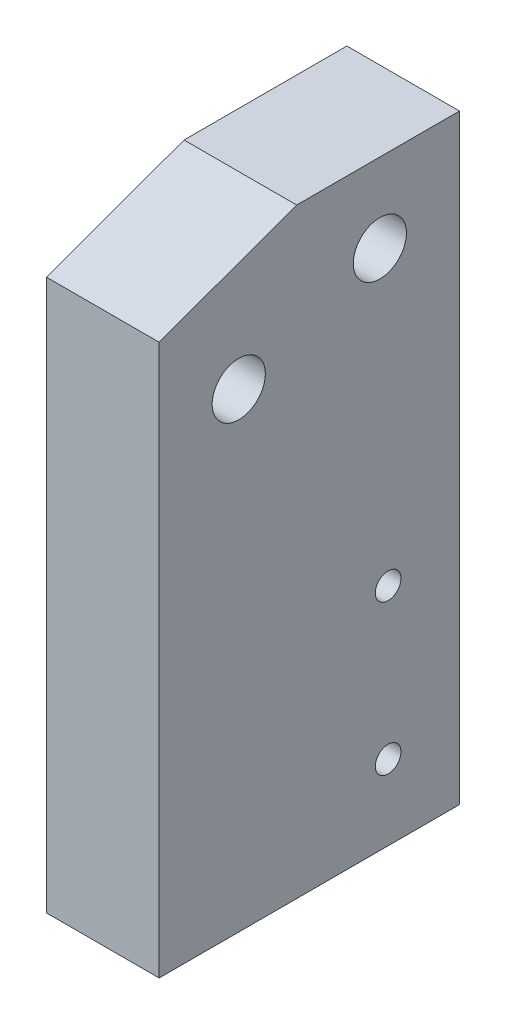
ISO-10303-21;
HEADER;
FILE_DESCRIPTION(('STEP AP214'),'2;1');
FILE_NAME('part.step','',(''),(''),'','','');
FILE_SCHEMA(('AUTOMOTIVE_DESIGN { 1 0 10303 214 1 1 1 1 }'));
ENDSEC;
DATA;
#1=APPLICATION_CONTEXT('core data for automotive mechanical design processes');
#2=APPLICATION_PROTOCOL_DEFINITION('international standard','automotive_design',2000,#1);
#3=PRODUCT_CONTEXT('',#1,'mechanical');
#4=PRODUCT('Part','Part','',(#3));
#5=PRODUCT_RELATED_PRODUCT_CATEGORY('part','',(#4));
#6=PRODUCT_DEFINITION_FORMATION('','',#4);
#7=PRODUCT_DEFINITION_CONTEXT('part definition',#1,'design');
#8=PRODUCT_DEFINITION('design','',#6,#7);
#9=PRODUCT_DEFINITION_SHAPE('','',#8);
#10=(LENGTH_UNIT() NAMED_UNIT(*) SI_UNIT(.MILLI.,.METRE.));
#11=(NAMED_UNIT(*) PLANE_ANGLE_UNIT() SI_UNIT($,.RADIAN.));
#12=(NAMED_UNIT(*) SI_UNIT($,.STERADIAN.) SOLID_ANGLE_UNIT());
#13=UNCERTAINTY_MEASURE_WITH_UNIT(LENGTH_MEASURE(1.E-05),#10,'distance_accuracy_value','');
#14=(GEOMETRIC_REPRESENTATION_CONTEXT(3) GLOBAL_UNCERTAINTY_ASSIGNED_CONTEXT((#13)) GLOBAL_UNIT_ASSIGNED_CONTEXT((#10,
#11,#12)) REPRESENTATION_CONTEXT('',''));
#15=CARTESIAN_POINT('',(0.,0.,0.));
#16=DIRECTION('',(0.,0.,1.));
#17=DIRECTION('',(1.,0.,0.));
#18=AXIS2_PLACEMENT_3D('',#15,#16,#17);
#19=CARTESIAN_POINT('',(28.575,152.4,0.));
#20=DIRECTION('',(-1.,0.,0.));
#21=DIRECTION('',(0.,0.,1.));
#22=AXIS2_PLACEMENT_3D('',#19,#20,#21);
#23=PLANE('',#22);
#24=CARTESIAN_POINT('',(28.575,57.15,-58.1000000000001));
#25=DIRECTION('',(1.,0.,0.));
#26=DIRECTION('',(0.,0.,-1.));
#27=AXIS2_PLACEMENT_3D('',#24,#25,#26);
#28=CIRCLE('',#27,3.26389999999999);
#29=CARTESIAN_POINT('',(28.575,57.15,-61.3639000000001));
#30=VERTEX_POINT('',#29);
#31=EDGE_CURVE('E221',#30,#30,#28,.T.);
#32=ORIENTED_EDGE('',*,*,#31,.F.);
#33=EDGE_LOOP('',(#32));
#34=FACE_BOUND('',#33,.T.);
#35=CARTESIAN_POINT('',(28.575,19.05,-58.1000000000001));
#36=DIRECTION('',(1.,0.,0.));
#37=DIRECTION('',(0.,0.,-1.));
#38=AXIS2_PLACEMENT_3D('',#35,#36,#37);
#39=CIRCLE('',#38,3.26389999999999);
#40=CARTESIAN_POINT('',(28.575,19.05,-61.3639000000001));
#41=VERTEX_POINT('',#40);
#42=EDGE_CURVE('E167',#41,#41,#39,.T.);
#43=ORIENTED_EDGE('',*,*,#42,.F.);
#44=EDGE_LOOP('',(#43));
#45=FACE_BOUND('',#44,.T.);
#46=CARTESIAN_POINT('',(28.575,132.348217804812,-56.0011444259716));
#47=DIRECTION('',(1.,0.,0.));
#48=DIRECTION('',(0.,0.,-1.));
#49=AXIS2_PLACEMENT_3D('',#46,#47,#48);
#50=CIRCLE('',#49,6.74623999999999);
#51=CARTESIAN_POINT('',(28.575,132.348217804812,-62.7473844259716));
#52=VERTEX_POINT('',#51);
#53=EDGE_CURVE('E166',#52,#52,#50,.T.);
#54=ORIENTED_EDGE('',*,*,#53,.F.);
#55=EDGE_LOOP('',(#54));
#56=FACE_BOUND('',#55,.T.);
#57=DIRECTION('',(0.,0.,-1.));
#58=VECTOR('',#57,1.);
#59=CARTESIAN_POINT('',(28.575,152.4,0.));
#60=LINE('',#59,#58);
#61=CARTESIAN_POINT('',(28.575,152.4,-34.8929632270751));
#62=VERTEX_POINT('',#61);
#63=CARTESIAN_POINT('',(28.575,152.4,-76.2));
#64=VERTEX_POINT('',#63);
#65=EDGE_CURVE('E187',#62,#64,#60,.T.);
#66=ORIENTED_EDGE('',*,*,#65,.F.);
#67=DIRECTION('',(0.,-0.342020143325656,0.939692620785913));
#68=VECTOR('',#67,1.);
#69=CARTESIAN_POINT('',(28.575,152.4,-34.8929632270751));
#70=LINE('',#69,#68);
#71=CARTESIAN_POINT('',(28.575,139.7,0.));
#72=VERTEX_POINT('',#71);
#73=EDGE_CURVE('E58',#62,#72,#70,.T.);
#74=ORIENTED_EDGE('',*,*,#73,.T.);
#75=DIRECTION('',(0.,-1.,0.));
#76=VECTOR('',#75,1.);
#77=CARTESIAN_POINT('',(28.575,152.4,0.));
#78=LINE('',#77,#76);
#79=CARTESIAN_POINT('',(28.575,0.,0.));
#80=VERTEX_POINT('',#79);
#81=EDGE_CURVE('E51',#72,#80,#78,.T.);
#82=ORIENTED_EDGE('',*,*,#81,.T.);
#83=DIRECTION('',(0.,0.,-1.));
#84=VECTOR('',#83,1.);
#85=CARTESIAN_POINT('',(28.575,0.,0.));
#86=LINE('',#85,#84);
#87=CARTESIAN_POINT('',(28.575,0.,-76.2));
#88=VERTEX_POINT('',#87);
#89=EDGE_CURVE('E97',#80,#88,#86,.T.);
#90=ORIENTED_EDGE('',*,*,#89,.T.);
#91=DIRECTION('',(0.,-1.,0.));
#92=VECTOR('',#91,1.);
#93=CARTESIAN_POINT('',(28.575,152.4,-76.2));
#94=LINE('',#93,#92);
#95=EDGE_CURVE('E91',#64,#88,#94,.T.);
#96=ORIENTED_EDGE('',*,*,#95,.F.);
#97=EDGE_LOOP('',(#66,#74,#82,#90,#96));
#98=FACE_BOUND('',#97,.T.);
#99=CARTESIAN_POINT('',(28.575,119.317250344104,-20.1988555740284));
#100=DIRECTION('',(1.,0.,0.));
#101=DIRECTION('',(0.,0.,-1.));
#102=AXIS2_PLACEMENT_3D('',#99,#100,#101);
#103=CIRCLE('',#102,6.74623999999999);
#104=CARTESIAN_POINT('',(28.575,119.317250344104,-26.9450955740284));
#105=VERTEX_POINT('',#104);
#106=EDGE_CURVE('E118',#105,#105,#103,.T.);
#107=ORIENTED_EDGE('',*,*,#106,.F.);
#108=EDGE_LOOP('',(#107));
#109=FACE_BOUND('',#108,.T.);
#110=ADVANCED_FACE('F42',(#34,#45,#56,#98,#109),#23,.F.);
#111=CARTESIAN_POINT('',(0.,152.4,0.));
#112=DIRECTION('',(1.,0.,0.));
#113=DIRECTION('',(0.,0.,-1.));
#114=AXIS2_PLACEMENT_3D('',#111,#112,#113);
#115=PLANE('',#114);
#116=CARTESIAN_POINT('',(0.,57.15,-18.1));
#117=DIRECTION('',(-1.,0.,0.));
#118=DIRECTION('',(0.,0.,1.));
#119=AXIS2_PLACEMENT_3D('',#116,#117,#118);
#120=CIRCLE('',#119,3.26389999999999);
#121=CARTESIAN_POINT('',(0.,57.15,-14.8361));
#122=VERTEX_POINT('',#121);
#123=EDGE_CURVE('E202',#122,#122,#120,.T.);
#124=ORIENTED_EDGE('',*,*,#123,.F.);
#125=EDGE_LOOP('',(#124));
#126=FACE_BOUND('',#125,.T.);
#127=CARTESIAN_POINT('',(0.,19.05,-18.1));
#128=DIRECTION('',(-1.,0.,0.));
#129=DIRECTION('',(0.,0.,1.));
#130=AXIS2_PLACEMENT_3D('',#127,#128,#129);
#131=CIRCLE('',#130,3.26389999999999);
#132=CARTESIAN_POINT('',(0.,19.05,-14.8361));
#133=VERTEX_POINT('',#132);
#134=EDGE_CURVE('E213',#133,#133,#131,.T.);
#135=ORIENTED_EDGE('',*,*,#134,.F.);
#136=EDGE_LOOP('',(#135));
#137=FACE_BOUND('',#136,.T.);
#138=CARTESIAN_POINT('',(0.,132.348217804812,-56.0011444259716));
#139=DIRECTION('',(1.,0.,0.));
#140=DIRECTION('',(0.,0.,-1.));
#141=AXIS2_PLACEMENT_3D('',#138,#139,#140);
#142=CIRCLE('',#141,6.74623999999999);
#143=CARTESIAN_POINT('',(0.,132.348217804812,-62.7473844259716));
#144=VERTEX_POINT('',#143);
#145=EDGE_CURVE('E173',#144,#144,#142,.T.);
#146=ORIENTED_EDGE('',*,*,#145,.T.);
#147=EDGE_LOOP('',(#146));
#148=FACE_BOUND('',#147,.T.);
#149=CARTESIAN_POINT('',(0.,119.317250344104,-20.1988555740284));
#150=DIRECTION('',(1.,0.,0.));
#151=DIRECTION('',(0.,0.,-1.));
#152=AXIS2_PLACEMENT_3D('',#149,#150,#151);
#153=CIRCLE('',#152,6.74623999999999);
#154=CARTESIAN_POINT('',(0.,119.317250344104,-26.9450955740284));
#155=VERTEX_POINT('',#154);
#156=EDGE_CURVE('E111',#155,#155,#153,.T.);
#157=ORIENTED_EDGE('',*,*,#156,.T.);
#158=EDGE_LOOP('',(#157));
#159=FACE_BOUND('',#158,.T.);
#160=DIRECTION('',(0.,-1.,0.));
#161=VECTOR('',#160,1.);
#162=CARTESIAN_POINT('',(0.,152.4,0.));
#163=LINE('',#162,#161);
#164=CARTESIAN_POINT('',(0.,139.7,0.));
#165=VERTEX_POINT('',#164);
#166=CARTESIAN_POINT('',(0.,0.,0.));
#167=VERTEX_POINT('',#166);
#168=EDGE_CURVE('E11',#165,#167,#163,.T.);
#169=ORIENTED_EDGE('',*,*,#168,.F.);
#170=DIRECTION('',(0.,-0.342020143325656,0.939692620785913));
#171=VECTOR('',#170,1.);
#172=CARTESIAN_POINT('',(0.,152.4,-34.8929632270751));
#173=LINE('',#172,#171);
#174=CARTESIAN_POINT('',(0.,152.4,-34.8929632270751));
#175=VERTEX_POINT('',#174);
#176=EDGE_CURVE('E140',#175,#165,#173,.T.);
#177=ORIENTED_EDGE('',*,*,#176,.F.);
#178=DIRECTION('',(0.,0.,1.));
#179=VECTOR('',#178,1.);
#180=CARTESIAN_POINT('',(0.,152.4,0.));
#181=LINE('',#180,#179);
#182=CARTESIAN_POINT('',(0.,152.4,-76.2));
#183=VERTEX_POINT('',#182);
#184=EDGE_CURVE('E96',#183,#175,#181,.T.);
#185=ORIENTED_EDGE('',*,*,#184,.F.);
#186=DIRECTION('',(0.,-1.,0.));
#187=VECTOR('',#186,1.);
#188=CARTESIAN_POINT('',(0.,152.4,-76.2));
#189=LINE('',#188,#187);
#190=CARTESIAN_POINT('',(0.,0.,-76.2));
#191=VERTEX_POINT('',#190);
#192=EDGE_CURVE('E88',#183,#191,#189,.T.);
#193=ORIENTED_EDGE('',*,*,#192,.T.);
#194=DIRECTION('',(0.,0.,1.));
#195=VECTOR('',#194,1.);
#196=CARTESIAN_POINT('',(0.,0.,0.));
#197=LINE('',#196,#195);
#198=EDGE_CURVE('E102',#191,#167,#197,.T.);
#199=ORIENTED_EDGE('',*,*,#198,.T.);
#200=EDGE_LOOP('',(#169,#177,#185,#193,#199));
#201=FACE_BOUND('',#200,.T.);
#202=ADVANCED_FACE('F44',(#126,#137,#148,#159,#201),#115,.F.);
#203=CARTESIAN_POINT('',(0.,152.4,0.));
#204=DIRECTION('',(0.,0.,-1.));
#205=DIRECTION('',(-1.,0.,0.));
#206=AXIS2_PLACEMENT_3D('',#203,#204,#205);
#207=PLANE('',#206);
#208=ORIENTED_EDGE('',*,*,#81,.F.);
#209=DIRECTION('',(-1.,0.,0.));
#210=VECTOR('',#209,1.);
#211=CARTESIAN_POINT('',(28.575,139.7,0.));
#212=LINE('',#211,#210);
#213=EDGE_CURVE('E137',#72,#165,#212,.T.);
#214=ORIENTED_EDGE('',*,*,#213,.T.);
#215=ORIENTED_EDGE('',*,*,#168,.T.);
#216=DIRECTION('',(1.,0.,0.));
#217=VECTOR('',#216,1.);
#218=CARTESIAN_POINT('',(0.,0.,0.));
#219=LINE('',#218,#217);
#220=EDGE_CURVE('E109',#167,#80,#219,.T.);
#221=ORIENTED_EDGE('',*,*,#220,.T.);
#222=EDGE_LOOP('',(#208,#214,#215,#221));
#223=FACE_BOUND('',#222,.T.);
#224=ADVANCED_FACE('F135',(#223),#207,.F.);
#225=CARTESIAN_POINT('',(0.,152.4,-76.2));
#226=DIRECTION('',(0.,0.,1.));
#227=DIRECTION('',(1.,0.,0.));
#228=AXIS2_PLACEMENT_3D('',#225,#226,#227);
#229=PLANE('',#228);
#230=DIRECTION('',(-1.,0.,0.));
#231=VECTOR('',#230,1.);
#232=CARTESIAN_POINT('',(0.,0.,-76.2));
#233=LINE('',#232,#231);
#234=EDGE_CURVE('E85',#88,#191,#233,.T.);
#235=ORIENTED_EDGE('',*,*,#234,.T.);
#236=ORIENTED_EDGE('',*,*,#192,.F.);
#237=DIRECTION('',(-1.,0.,0.));
#238=VECTOR('',#237,1.);
#239=CARTESIAN_POINT('',(0.,152.4,-76.2));
#240=LINE('',#239,#238);
#241=EDGE_CURVE('E67',#64,#183,#240,.T.);
#242=ORIENTED_EDGE('',*,*,#241,.F.);
#243=ORIENTED_EDGE('',*,*,#95,.T.);
#244=EDGE_LOOP('',(#235,#236,#242,#243));
#245=FACE_BOUND('',#244,.T.);
#246=ADVANCED_FACE('F87',(#245),#229,.F.);
#247=CARTESIAN_POINT('',(0.,152.4,0.));
#248=DIRECTION('',(0.,-1.,0.));
#249=DIRECTION('',(0.,0.,-1.));
#250=AXIS2_PLACEMENT_3D('',#247,#248,#249);
#251=PLANE('',#250);
#252=ORIENTED_EDGE('',*,*,#184,.T.);
#253=DIRECTION('',(-1.,0.,0.));
#254=VECTOR('',#253,1.);
#255=CARTESIAN_POINT('',(28.575,152.4,-34.8929632270751));
#256=LINE('',#255,#254);
#257=EDGE_CURVE('E196',#62,#175,#256,.T.);
#258=ORIENTED_EDGE('',*,*,#257,.F.);
#259=ORIENTED_EDGE('',*,*,#65,.T.);
#260=ORIENTED_EDGE('',*,*,#241,.T.);
#261=EDGE_LOOP('',(#252,#258,#259,#260));
#262=FACE_BOUND('',#261,.T.);
#263=ADVANCED_FACE('F195',(#262),#251,.F.);
#264=CARTESIAN_POINT('',(0.,0.,0.));
#265=DIRECTION('',(0.,-1.,0.));
#266=DIRECTION('',(0.,0.,-1.));
#267=AXIS2_PLACEMENT_3D('',#264,#265,#266);
#268=PLANE('',#267);
#269=ORIENTED_EDGE('',*,*,#198,.F.);
#270=ORIENTED_EDGE('',*,*,#234,.F.);
#271=ORIENTED_EDGE('',*,*,#89,.F.);
#272=ORIENTED_EDGE('',*,*,#220,.F.);
#273=EDGE_LOOP('',(#269,#270,#271,#272));
#274=FACE_BOUND('',#273,.T.);
#275=ADVANCED_FACE('F107',(#274),#268,.T.);
#276=CARTESIAN_POINT('',(28.575,119.317250344104,-20.1988555740284));
#277=DIRECTION('',(1.,0.,0.));
#278=DIRECTION('',(0.,0.,-1.));
#279=AXIS2_PLACEMENT_3D('',#276,#277,#278);
#280=CYLINDRICAL_SURFACE('',#279,6.74623999999999);
#281=ORIENTED_EDGE('',*,*,#156,.F.);
#282=EDGE_LOOP('',(#281));
#283=FACE_BOUND('',#282,.T.);
#284=ORIENTED_EDGE('',*,*,#106,.T.);
#285=EDGE_LOOP('',(#284));
#286=FACE_BOUND('',#285,.T.);
#287=ADVANCED_FACE('F246',(#283,#286),#280,.F.);
#288=CARTESIAN_POINT('',(28.575,132.348217804812,-56.0011444259716));
#289=DIRECTION('',(1.,0.,0.));
#290=DIRECTION('',(0.,0.,-1.));
#291=AXIS2_PLACEMENT_3D('',#288,#289,#290);
#292=CYLINDRICAL_SURFACE('',#291,6.74623999999999);
#293=ORIENTED_EDGE('',*,*,#145,.F.);
#294=EDGE_LOOP('',(#293));
#295=FACE_BOUND('',#294,.T.);
#296=ORIENTED_EDGE('',*,*,#53,.T.);
#297=EDGE_LOOP('',(#296));
#298=FACE_BOUND('',#297,.T.);
#299=ADVANCED_FACE('F159',(#295,#298),#292,.F.);
#300=CARTESIAN_POINT('',(15.875,19.05,-58.1000000000001));
#301=DIRECTION('',(1.,0.,0.));
#302=DIRECTION('',(0.,0.,-1.));
#303=AXIS2_PLACEMENT_3D('',#300,#301,#302);
#304=CONICAL_SURFACE('',#303,3.2639,1.02974425867665);
#305=CARTESIAN_POINT('',(13.9138510255559,19.05,-58.1000000000001));
#306=VERTEX_POINT('',#305);
#307=VERTEX_LOOP('',#306);
#308=FACE_BOUND('',#307,.T.);
#309=CARTESIAN_POINT('',(15.875,19.05,-58.1000000000001));
#310=DIRECTION('',(1.,0.,0.));
#311=DIRECTION('',(0.,0.,-1.));
#312=AXIS2_PLACEMENT_3D('',#309,#310,#311);
#313=CIRCLE('',#312,3.2639);
#314=CARTESIAN_POINT('',(15.875,19.05,-61.3639000000001));
#315=VERTEX_POINT('',#314);
#316=EDGE_CURVE('E163',#315,#315,#313,.T.);
#317=ORIENTED_EDGE('',*,*,#316,.T.);
#318=EDGE_LOOP('',(#317));
#319=FACE_BOUND('',#318,.T.);
#320=ADVANCED_FACE('F155',(#308,#319),#304,.F.);
#321=CARTESIAN_POINT('',(28.575,19.05,-58.1000000000001));
#322=DIRECTION('',(1.,0.,0.));
#323=DIRECTION('',(0.,0.,-1.));
#324=AXIS2_PLACEMENT_3D('',#321,#322,#323);
#325=CYLINDRICAL_SURFACE('',#324,3.26389999999999);
#326=ORIENTED_EDGE('',*,*,#316,.F.);
#327=EDGE_LOOP('',(#326));
#328=FACE_BOUND('',#327,.T.);
#329=ORIENTED_EDGE('',*,*,#42,.T.);
#330=EDGE_LOOP('',(#329));
#331=FACE_BOUND('',#330,.T.);
#332=ADVANCED_FACE('F158',(#328,#331),#325,.F.);
#333=CARTESIAN_POINT('',(15.875,57.15,-58.1000000000001));
#334=DIRECTION('',(1.,0.,0.));
#335=DIRECTION('',(0.,0.,-1.));
#336=AXIS2_PLACEMENT_3D('',#333,#334,#335);
#337=CONICAL_SURFACE('',#336,3.26389999999999,1.02974425867665);
#338=CARTESIAN_POINT('',(13.9138510255559,57.15,-58.1000000000001));
#339=VERTEX_POINT('',#338);
#340=VERTEX_LOOP('',#339);
#341=FACE_BOUND('',#340,.T.);
#342=CARTESIAN_POINT('',(15.875,57.15,-58.1000000000001));
#343=DIRECTION('',(1.,0.,0.));
#344=DIRECTION('',(0.,0.,-1.));
#345=AXIS2_PLACEMENT_3D('',#342,#343,#344);
#346=CIRCLE('',#345,3.26389999999999);
#347=CARTESIAN_POINT('',(15.875,57.15,-61.3639000000001));
#348=VERTEX_POINT('',#347);
#349=EDGE_CURVE('E176',#348,#348,#346,.T.);
#350=ORIENTED_EDGE('',*,*,#349,.T.);
#351=EDGE_LOOP('',(#350));
#352=FACE_BOUND('',#351,.T.);
#353=ADVANCED_FACE('F229',(#341,#352),#337,.F.);
#354=CARTESIAN_POINT('',(28.575,57.15,-58.1000000000001));
#355=DIRECTION('',(1.,0.,0.));
#356=DIRECTION('',(0.,0.,-1.));
#357=AXIS2_PLACEMENT_3D('',#354,#355,#356);
#358=CYLINDRICAL_SURFACE('',#357,3.26389999999999);
#359=ORIENTED_EDGE('',*,*,#349,.F.);
#360=EDGE_LOOP('',(#359));
#361=FACE_BOUND('',#360,.T.);
#362=ORIENTED_EDGE('',*,*,#31,.T.);
#363=EDGE_LOOP('',(#362));
#364=FACE_BOUND('',#363,.T.);
#365=ADVANCED_FACE('F231',(#361,#364),#358,.F.);
#366=CARTESIAN_POINT('',(12.7,19.05,-18.1));
#367=DIRECTION('',(-1.,0.,0.));
#368=DIRECTION('',(0.,0.,1.));
#369=AXIS2_PLACEMENT_3D('',#366,#367,#368);
#370=CONICAL_SURFACE('',#369,3.26389999999999,1.02974425867665);
#371=CARTESIAN_POINT('',(14.6611489744441,19.05,-18.1));
#372=VERTEX_POINT('',#371);
#373=VERTEX_LOOP('',#372);
#374=FACE_BOUND('',#373,.T.);
#375=CARTESIAN_POINT('',(12.7,19.05,-18.1));
#376=DIRECTION('',(-1.,0.,0.));
#377=DIRECTION('',(0.,0.,1.));
#378=AXIS2_PLACEMENT_3D('',#375,#376,#377);
#379=CIRCLE('',#378,3.26389999999999);
#380=CARTESIAN_POINT('',(12.7,19.05,-14.8361));
#381=VERTEX_POINT('',#380);
#382=EDGE_CURVE('E217',#381,#381,#379,.T.);
#383=ORIENTED_EDGE('',*,*,#382,.T.);
#384=EDGE_LOOP('',(#383));
#385=FACE_BOUND('',#384,.T.);
#386=ADVANCED_FACE('F234',(#374,#385),#370,.F.);
#387=CARTESIAN_POINT('',(0.,19.05,-18.1));
#388=DIRECTION('',(-1.,0.,0.));
#389=DIRECTION('',(0.,0.,1.));
#390=AXIS2_PLACEMENT_3D('',#387,#388,#389);
#391=CYLINDRICAL_SURFACE('',#390,3.26389999999999);
#392=ORIENTED_EDGE('',*,*,#382,.F.);
#393=EDGE_LOOP('',(#392));
#394=FACE_BOUND('',#393,.T.);
#395=ORIENTED_EDGE('',*,*,#134,.T.);
#396=EDGE_LOOP('',(#395));
#397=FACE_BOUND('',#396,.T.);
#398=ADVANCED_FACE('F278',(#394,#397),#391,.F.);
#399=CARTESIAN_POINT('',(12.7,57.15,-18.1));
#400=DIRECTION('',(-1.,0.,0.));
#401=DIRECTION('',(0.,0.,1.));
#402=AXIS2_PLACEMENT_3D('',#399,#400,#401);
#403=CONICAL_SURFACE('',#402,3.26389999999999,1.02974425867665);
#404=CARTESIAN_POINT('',(14.6611489744441,57.15,-18.1));
#405=VERTEX_POINT('',#404);
#406=VERTEX_LOOP('',#405);
#407=FACE_BOUND('',#406,.T.);
#408=CARTESIAN_POINT('',(12.7,57.15,-18.1));
#409=DIRECTION('',(-1.,0.,0.));
#410=DIRECTION('',(0.,0.,1.));
#411=AXIS2_PLACEMENT_3D('',#408,#409,#410);
#412=CIRCLE('',#411,3.26389999999999);
#413=CARTESIAN_POINT('',(12.7,57.15,-14.8361));
#414=VERTEX_POINT('',#413);
#415=EDGE_CURVE('E209',#414,#414,#412,.T.);
#416=ORIENTED_EDGE('',*,*,#415,.T.);
#417=EDGE_LOOP('',(#416));
#418=FACE_BOUND('',#417,.T.);
#419=ADVANCED_FACE('F280',(#407,#418),#403,.F.);
#420=CARTESIAN_POINT('',(0.,57.15,-18.1));
#421=DIRECTION('',(-1.,0.,0.));
#422=DIRECTION('',(0.,0.,1.));
#423=AXIS2_PLACEMENT_3D('',#420,#421,#422);
#424=CYLINDRICAL_SURFACE('',#423,3.26389999999999);
#425=ORIENTED_EDGE('',*,*,#415,.F.);
#426=EDGE_LOOP('',(#425));
#427=FACE_BOUND('',#426,.T.);
#428=ORIENTED_EDGE('',*,*,#123,.T.);
#429=EDGE_LOOP('',(#428));
#430=FACE_BOUND('',#429,.T.);
#431=ADVANCED_FACE('F287',(#427,#430),#424,.F.);
#432=CARTESIAN_POINT('',(28.575,152.4,-34.8929632270751));
#433=DIRECTION('',(0.,-0.939692620785913,-0.342020143325656));
#434=DIRECTION('',(0.,0.342020143325656,-0.939692620785913));
#435=AXIS2_PLACEMENT_3D('',#432,#433,#434);
#436=PLANE('',#435);
#437=ORIENTED_EDGE('',*,*,#176,.T.);
#438=ORIENTED_EDGE('',*,*,#213,.F.);
#439=ORIENTED_EDGE('',*,*,#73,.F.);
#440=ORIENTED_EDGE('',*,*,#257,.T.);
#441=EDGE_LOOP('',(#437,#438,#439,#440));
#442=FACE_BOUND('',#441,.T.);
#443=ADVANCED_FACE('F337',(#442),#436,.F.);
#444=CLOSED_SHELL('',(#110,#202,#224,#246,#263,#275,#287,#299,#320,#332,#353,#365,#386,#398,
#419,#431,#443));
#445=MANIFOLD_SOLID_BREP('B2',#444);
#446=ADVANCED_BREP_SHAPE_REPRESENTATION('',(#18,#445),#14);
#447=SHAPE_DEFINITION_REPRESENTATION(#9,#446);
ENDSEC;
END-ISO-10303-21;
